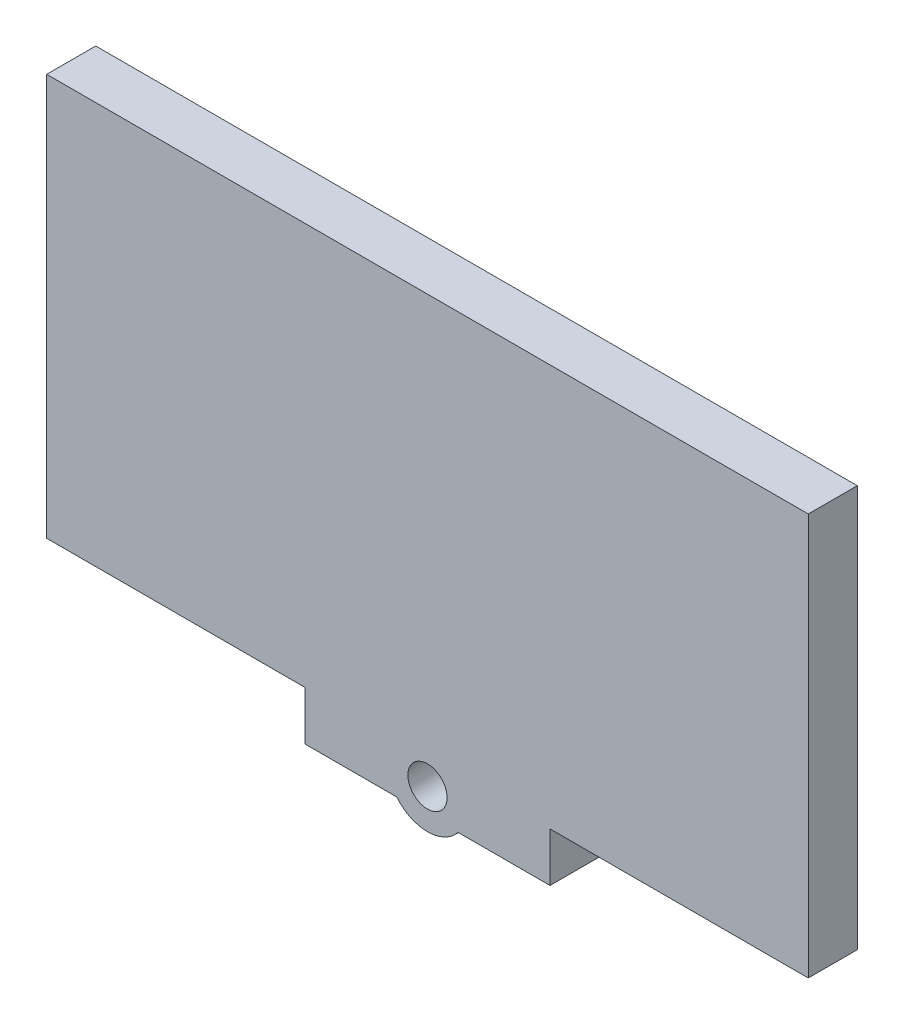
ISO-10303-21;
HEADER;
FILE_DESCRIPTION(('STEP AP214'),'2;1');
FILE_NAME('part.step','',(''),(''),'','','');
FILE_SCHEMA(('AUTOMOTIVE_DESIGN { 1 0 10303 214 1 1 1 1 }'));
ENDSEC;
DATA;
#1=APPLICATION_CONTEXT('core data for automotive mechanical design processes');
#2=APPLICATION_PROTOCOL_DEFINITION('international standard','automotive_design',2000,#1);
#3=PRODUCT_CONTEXT('',#1,'mechanical');
#4=PRODUCT('Part','Part','',(#3));
#5=PRODUCT_RELATED_PRODUCT_CATEGORY('part','',(#4));
#6=PRODUCT_DEFINITION_FORMATION('','',#4);
#7=PRODUCT_DEFINITION_CONTEXT('part definition',#1,'design');
#8=PRODUCT_DEFINITION('design','',#6,#7);
#9=PRODUCT_DEFINITION_SHAPE('','',#8);
#10=(LENGTH_UNIT() NAMED_UNIT(*) SI_UNIT(.MILLI.,.METRE.));
#11=(NAMED_UNIT(*) PLANE_ANGLE_UNIT() SI_UNIT($,.RADIAN.));
#12=(NAMED_UNIT(*) SI_UNIT($,.STERADIAN.) SOLID_ANGLE_UNIT());
#13=UNCERTAINTY_MEASURE_WITH_UNIT(LENGTH_MEASURE(1.E-05),#10,'distance_accuracy_value','');
#14=(GEOMETRIC_REPRESENTATION_CONTEXT(3) GLOBAL_UNCERTAINTY_ASSIGNED_CONTEXT((#13)) GLOBAL_UNIT_ASSIGNED_CONTEXT((#10,
#11,#12)) REPRESENTATION_CONTEXT('',''));
#15=CARTESIAN_POINT('',(0.,0.,0.));
#16=DIRECTION('',(0.,0.,1.));
#17=DIRECTION('',(1.,0.,0.));
#18=AXIS2_PLACEMENT_3D('',#15,#16,#17);
#19=CARTESIAN_POINT('',(-12.5,-25.5,0.));
#20=DIRECTION('',(0.,-1.,0.));
#21=DIRECTION('',(0.,0.,-1.));
#22=AXIS2_PLACEMENT_3D('',#19,#20,#21);
#23=PLANE('',#22);
#24=DIRECTION('',(0.,0.,1.));
#25=VECTOR('',#24,1.);
#26=CARTESIAN_POINT('',(3.12100929492651,-25.5,0.));
#27=LINE('',#26,#25);
#28=CARTESIAN_POINT('',(3.12100929492651,-25.5,0.));
#29=VERTEX_POINT('',#28);
#30=CARTESIAN_POINT('',(3.12100929492651,-25.5,5.));
#31=VERTEX_POINT('',#30);
#32=EDGE_CURVE('E11',#29,#31,#27,.T.);
#33=ORIENTED_EDGE('',*,*,#32,.F.);
#34=DIRECTION('',(1.,0.,0.));
#35=VECTOR('',#34,1.);
#36=CARTESIAN_POINT('',(-12.5,-25.5,0.));
#37=LINE('',#36,#35);
#38=CARTESIAN_POINT('',(12.5,-25.5,0.));
#39=VERTEX_POINT('',#38);
#40=EDGE_CURVE('E190',#29,#39,#37,.T.);
#41=ORIENTED_EDGE('',*,*,#40,.T.);
#42=DIRECTION('',(0.,0.,1.));
#43=VECTOR('',#42,1.);
#44=CARTESIAN_POINT('',(12.5,-25.5,0.));
#45=LINE('',#44,#43);
#46=CARTESIAN_POINT('',(12.5,-25.5,5.));
#47=VERTEX_POINT('',#46);
#48=EDGE_CURVE('E139',#39,#47,#45,.T.);
#49=ORIENTED_EDGE('',*,*,#48,.T.);
#50=DIRECTION('',(1.,0.,0.));
#51=VECTOR('',#50,1.);
#52=CARTESIAN_POINT('',(-12.5,-25.5,5.));
#53=LINE('',#52,#51);
#54=EDGE_CURVE('E126',#31,#47,#53,.T.);
#55=ORIENTED_EDGE('',*,*,#54,.F.);
#56=EDGE_LOOP('',(#33,#41,#49,#55));
#57=FACE_BOUND('',#56,.T.);
#58=ADVANCED_FACE('F33',(#57),#23,.T.);
#59=CARTESIAN_POINT('',(-38.85,-20.5,5.));
#60=DIRECTION('',(0.,1.,0.));
#61=DIRECTION('',(0.,0.,1.));
#62=AXIS2_PLACEMENT_3D('',#59,#60,#61);
#63=PLANE('',#62);
#64=DIRECTION('',(0.,0.,1.));
#65=VECTOR('',#64,1.);
#66=CARTESIAN_POINT('',(12.5,-20.5,0.));
#67=LINE('',#66,#65);
#68=CARTESIAN_POINT('',(12.5,-20.5,0.));
#69=VERTEX_POINT('',#68);
#70=CARTESIAN_POINT('',(12.5,-20.5,5.));
#71=VERTEX_POINT('',#70);
#72=EDGE_CURVE('E137',#69,#71,#67,.T.);
#73=ORIENTED_EDGE('',*,*,#72,.F.);
#74=DIRECTION('',(1.,0.,0.));
#75=VECTOR('',#74,1.);
#76=CARTESIAN_POINT('',(-38.85,-20.5,0.));
#77=LINE('',#76,#75);
#78=CARTESIAN_POINT('',(38.85,-20.5,0.));
#79=VERTEX_POINT('',#78);
#80=EDGE_CURVE('E159',#69,#79,#77,.T.);
#81=ORIENTED_EDGE('',*,*,#80,.T.);
#82=DIRECTION('',(0.,0.,-1.));
#83=VECTOR('',#82,1.);
#84=CARTESIAN_POINT('',(38.85,-20.5,5.));
#85=LINE('',#84,#83);
#86=CARTESIAN_POINT('',(38.85,-20.5,5.));
#87=VERTEX_POINT('',#86);
#88=EDGE_CURVE('E171',#87,#79,#85,.T.);
#89=ORIENTED_EDGE('',*,*,#88,.F.);
#90=DIRECTION('',(1.,0.,0.));
#91=VECTOR('',#90,1.);
#92=CARTESIAN_POINT('',(-38.85,-20.5,5.));
#93=LINE('',#92,#91);
#94=EDGE_CURVE('E148',#71,#87,#93,.T.);
#95=ORIENTED_EDGE('',*,*,#94,.F.);
#96=EDGE_LOOP('',(#73,#81,#89,#95));
#97=FACE_BOUND('',#96,.T.);
#98=ADVANCED_FACE('F205',(#97),#63,.F.);
#99=CARTESIAN_POINT('',(-38.85,20.5,5.));
#100=DIRECTION('',(1.,0.,0.));
#101=DIRECTION('',(0.,0.,-1.));
#102=AXIS2_PLACEMENT_3D('',#99,#100,#101);
#103=PLANE('',#102);
#104=DIRECTION('',(0.,-1.,0.));
#105=VECTOR('',#104,1.);
#106=CARTESIAN_POINT('',(-38.85,20.5,0.));
#107=LINE('',#106,#105);
#108=CARTESIAN_POINT('',(-38.85,20.5,0.));
#109=VERTEX_POINT('',#108);
#110=CARTESIAN_POINT('',(-38.85,-20.5,0.));
#111=VERTEX_POINT('',#110);
#112=EDGE_CURVE('E136',#109,#111,#107,.T.);
#113=ORIENTED_EDGE('',*,*,#112,.T.);
#114=DIRECTION('',(0.,0.,-1.));
#115=VECTOR('',#114,1.);
#116=CARTESIAN_POINT('',(-38.85,-20.5,5.));
#117=LINE('',#116,#115);
#118=CARTESIAN_POINT('',(-38.85,-20.5,5.));
#119=VERTEX_POINT('',#118);
#120=EDGE_CURVE('E121',#119,#111,#117,.T.);
#121=ORIENTED_EDGE('',*,*,#120,.F.);
#122=DIRECTION('',(0.,-1.,0.));
#123=VECTOR('',#122,1.);
#124=CARTESIAN_POINT('',(-38.85,20.5,5.));
#125=LINE('',#124,#123);
#126=CARTESIAN_POINT('',(-38.85,20.5,5.));
#127=VERTEX_POINT('',#126);
#128=EDGE_CURVE('E145',#127,#119,#125,.T.);
#129=ORIENTED_EDGE('',*,*,#128,.F.);
#130=DIRECTION('',(0.,0.,-1.));
#131=VECTOR('',#130,1.);
#132=CARTESIAN_POINT('',(-38.85,20.5,5.));
#133=LINE('',#132,#131);
#134=EDGE_CURVE('E156',#127,#109,#133,.T.);
#135=ORIENTED_EDGE('',*,*,#134,.T.);
#136=EDGE_LOOP('',(#113,#121,#129,#135));
#137=FACE_BOUND('',#136,.T.);
#138=ADVANCED_FACE('F35',(#137),#103,.F.);
#139=CARTESIAN_POINT('',(-12.5,-20.5,0.));
#140=VERTEX_POINT('',#139);
#141=EDGE_CURVE('E160',#111,#140,#77,.T.);
#142=ORIENTED_EDGE('',*,*,#141,.T.);
#143=DIRECTION('',(0.,0.,1.));
#144=VECTOR('',#143,1.);
#145=CARTESIAN_POINT('',(-12.5,-20.5,0.));
#146=LINE('',#145,#144);
#147=CARTESIAN_POINT('',(-12.5,-20.5,5.));
#148=VERTEX_POINT('',#147);
#149=EDGE_CURVE('E134',#140,#148,#146,.T.);
#150=ORIENTED_EDGE('',*,*,#149,.T.);
#151=EDGE_CURVE('E150',#119,#148,#93,.T.);
#152=ORIENTED_EDGE('',*,*,#151,.F.);
#153=ORIENTED_EDGE('',*,*,#120,.T.);
#154=EDGE_LOOP('',(#142,#150,#152,#153));
#155=FACE_BOUND('',#154,.T.);
#156=ADVANCED_FACE('F177',(#155),#63,.F.);
#157=CARTESIAN_POINT('',(38.85,20.5,5.));
#158=DIRECTION('',(-1.,0.,0.));
#159=DIRECTION('',(0.,-1.,0.));
#160=AXIS2_PLACEMENT_3D('',#157,#158,#159);
#161=PLANE('',#160);
#162=DIRECTION('',(0.,1.,0.));
#163=VECTOR('',#162,1.);
#164=CARTESIAN_POINT('',(38.85,20.5,0.));
#165=LINE('',#164,#163);
#166=CARTESIAN_POINT('',(38.85,20.5,0.));
#167=VERTEX_POINT('',#166);
#168=EDGE_CURVE('E163',#79,#167,#165,.T.);
#169=ORIENTED_EDGE('',*,*,#168,.T.);
#170=DIRECTION('',(0.,0.,-1.));
#171=VECTOR('',#170,1.);
#172=CARTESIAN_POINT('',(38.85,20.5,5.));
#173=LINE('',#172,#171);
#174=CARTESIAN_POINT('',(38.85,20.5,5.));
#175=VERTEX_POINT('',#174);
#176=EDGE_CURVE('E168',#175,#167,#173,.T.);
#177=ORIENTED_EDGE('',*,*,#176,.F.);
#178=DIRECTION('',(0.,1.,0.));
#179=VECTOR('',#178,1.);
#180=CARTESIAN_POINT('',(38.85,20.5,5.));
#181=LINE('',#180,#179);
#182=EDGE_CURVE('E152',#87,#175,#181,.T.);
#183=ORIENTED_EDGE('',*,*,#182,.F.);
#184=ORIENTED_EDGE('',*,*,#88,.T.);
#185=EDGE_LOOP('',(#169,#177,#183,#184));
#186=FACE_BOUND('',#185,.T.);
#187=ADVANCED_FACE('F209',(#186),#161,.F.);
#188=CARTESIAN_POINT('',(-38.85,20.5,5.));
#189=DIRECTION('',(0.,-1.,0.));
#190=DIRECTION('',(0.,0.,-1.));
#191=AXIS2_PLACEMENT_3D('',#188,#189,#190);
#192=PLANE('',#191);
#193=DIRECTION('',(-1.,0.,0.));
#194=VECTOR('',#193,1.);
#195=CARTESIAN_POINT('',(-38.85,20.5,0.));
#196=LINE('',#195,#194);
#197=EDGE_CURVE('E149',#167,#109,#196,.T.);
#198=ORIENTED_EDGE('',*,*,#197,.T.);
#199=ORIENTED_EDGE('',*,*,#134,.F.);
#200=DIRECTION('',(-1.,0.,0.));
#201=VECTOR('',#200,1.);
#202=CARTESIAN_POINT('',(-38.85,20.5,5.));
#203=LINE('',#202,#201);
#204=EDGE_CURVE('E154',#175,#127,#203,.T.);
#205=ORIENTED_EDGE('',*,*,#204,.F.);
#206=ORIENTED_EDGE('',*,*,#176,.T.);
#207=EDGE_LOOP('',(#198,#199,#205,#206));
#208=FACE_BOUND('',#207,.T.);
#209=ADVANCED_FACE('F213',(#208),#192,.F.);
#210=CARTESIAN_POINT('',(0.,0.,5.));
#211=DIRECTION('',(0.,0.,1.));
#212=DIRECTION('',(1.,0.,0.));
#213=AXIS2_PLACEMENT_3D('',#210,#211,#212);
#214=PLANE('',#213);
#215=CARTESIAN_POINT('',(-12.5,-25.5,5.));
#216=VERTEX_POINT('',#215);
#217=CARTESIAN_POINT('',(-3.12398870347189,-25.5,5.));
#218=VERTEX_POINT('',#217);
#219=EDGE_CURVE('E118',#216,#218,#53,.T.);
#220=ORIENTED_EDGE('',*,*,#219,.T.);
#221=CARTESIAN_POINT('',(-0.00148970427268913,-23.,5.));
#222=DIRECTION('',(0.,0.,1.));
#223=DIRECTION('',(1.,0.,0.));
#224=AXIS2_PLACEMENT_3D('',#221,#222,#223);
#225=CIRCLE('',#224,4.);
#226=EDGE_CURVE('E48',#218,#31,#225,.T.);
#227=ORIENTED_EDGE('',*,*,#226,.T.);
#228=ORIENTED_EDGE('',*,*,#54,.T.);
#229=DIRECTION('',(0.,1.,0.));
#230=VECTOR('',#229,1.);
#231=CARTESIAN_POINT('',(12.5,-20.5,5.));
#232=LINE('',#231,#230);
#233=EDGE_CURVE('E125',#47,#71,#232,.T.);
#234=ORIENTED_EDGE('',*,*,#233,.T.);
#235=ORIENTED_EDGE('',*,*,#94,.T.);
#236=ORIENTED_EDGE('',*,*,#182,.T.);
#237=ORIENTED_EDGE('',*,*,#204,.T.);
#238=ORIENTED_EDGE('',*,*,#128,.T.);
#239=ORIENTED_EDGE('',*,*,#151,.T.);
#240=DIRECTION('',(0.,-1.,0.));
#241=VECTOR('',#240,1.);
#242=CARTESIAN_POINT('',(-12.5,-20.5,5.));
#243=LINE('',#242,#241);
#244=EDGE_CURVE('E55',#148,#216,#243,.T.);
#245=ORIENTED_EDGE('',*,*,#244,.T.);
#246=EDGE_LOOP('',(#220,#227,#228,#234,#235,#236,#237,#238,#239,#245));
#247=FACE_BOUND('',#246,.T.);
#248=CARTESIAN_POINT('',(-0.00148970427268913,-23.,5.));
#249=DIRECTION('',(0.,0.,1.));
#250=DIRECTION('',(1.,0.,0.));
#251=AXIS2_PLACEMENT_3D('',#248,#249,#250);
#252=CIRCLE('',#251,2.);
#253=CARTESIAN_POINT('',(1.99851029572731,-23.,5.));
#254=VERTEX_POINT('',#253);
#255=EDGE_CURVE('E194',#254,#254,#252,.T.);
#256=ORIENTED_EDGE('',*,*,#255,.F.);
#257=EDGE_LOOP('',(#256));
#258=FACE_BOUND('',#257,.T.);
#259=ADVANCED_FACE('F122',(#247,#258),#214,.T.);
#260=CARTESIAN_POINT('',(0.,0.,0.));
#261=DIRECTION('',(0.,0.,1.));
#262=DIRECTION('',(1.,0.,0.));
#263=AXIS2_PLACEMENT_3D('',#260,#261,#262);
#264=PLANE('',#263);
#265=ORIENTED_EDGE('',*,*,#40,.F.);
#266=CARTESIAN_POINT('',(-0.00148970427268913,-23.,0.));
#267=DIRECTION('',(0.,0.,1.));
#268=DIRECTION('',(1.,0.,0.));
#269=AXIS2_PLACEMENT_3D('',#266,#267,#268);
#270=CIRCLE('',#269,4.);
#271=CARTESIAN_POINT('',(-3.12398870347189,-25.5,0.));
#272=VERTEX_POINT('',#271);
#273=EDGE_CURVE('E112',#272,#29,#270,.T.);
#274=ORIENTED_EDGE('',*,*,#273,.F.);
#275=CARTESIAN_POINT('',(-12.5,-25.5,0.));
#276=VERTEX_POINT('',#275);
#277=EDGE_CURVE('E120',#276,#272,#37,.T.);
#278=ORIENTED_EDGE('',*,*,#277,.F.);
#279=DIRECTION('',(0.,-1.,0.));
#280=VECTOR('',#279,1.);
#281=CARTESIAN_POINT('',(-12.5,-20.5,0.));
#282=LINE('',#281,#280);
#283=EDGE_CURVE('E129',#140,#276,#282,.T.);
#284=ORIENTED_EDGE('',*,*,#283,.F.);
#285=ORIENTED_EDGE('',*,*,#141,.F.);
#286=ORIENTED_EDGE('',*,*,#112,.F.);
#287=ORIENTED_EDGE('',*,*,#197,.F.);
#288=ORIENTED_EDGE('',*,*,#168,.F.);
#289=ORIENTED_EDGE('',*,*,#80,.F.);
#290=DIRECTION('',(0.,1.,0.));
#291=VECTOR('',#290,1.);
#292=CARTESIAN_POINT('',(12.5,-20.5,0.));
#293=LINE('',#292,#291);
#294=EDGE_CURVE('E144',#39,#69,#293,.T.);
#295=ORIENTED_EDGE('',*,*,#294,.F.);
#296=EDGE_LOOP('',(#265,#274,#278,#284,#285,#286,#287,#288,#289,#295));
#297=FACE_BOUND('',#296,.T.);
#298=CARTESIAN_POINT('',(-0.00148970427268913,-23.,0.));
#299=DIRECTION('',(0.,0.,1.));
#300=DIRECTION('',(1.,0.,0.));
#301=AXIS2_PLACEMENT_3D('',#298,#299,#300);
#302=CIRCLE('',#301,2.);
#303=CARTESIAN_POINT('',(1.99851029572731,-23.,0.));
#304=VERTEX_POINT('',#303);
#305=EDGE_CURVE('E217',#304,#304,#302,.T.);
#306=ORIENTED_EDGE('',*,*,#305,.T.);
#307=EDGE_LOOP('',(#306));
#308=FACE_BOUND('',#307,.T.);
#309=ADVANCED_FACE('F185',(#297,#308),#264,.F.);
#310=CARTESIAN_POINT('',(-12.5,-20.5,0.));
#311=DIRECTION('',(-1.,0.,0.));
#312=DIRECTION('',(0.,0.,1.));
#313=AXIS2_PLACEMENT_3D('',#310,#311,#312);
#314=PLANE('',#313);
#315=ORIENTED_EDGE('',*,*,#244,.F.);
#316=ORIENTED_EDGE('',*,*,#149,.F.);
#317=ORIENTED_EDGE('',*,*,#283,.T.);
#318=DIRECTION('',(0.,0.,1.));
#319=VECTOR('',#318,1.);
#320=CARTESIAN_POINT('',(-12.5,-25.5,0.));
#321=LINE('',#320,#319);
#322=EDGE_CURVE('E142',#276,#216,#321,.T.);
#323=ORIENTED_EDGE('',*,*,#322,.T.);
#324=EDGE_LOOP('',(#315,#316,#317,#323));
#325=FACE_BOUND('',#324,.T.);
#326=ADVANCED_FACE('F232',(#325),#314,.T.);
#327=CARTESIAN_POINT('',(12.5,-20.5,0.));
#328=DIRECTION('',(1.,0.,0.));
#329=DIRECTION('',(0.,0.,-1.));
#330=AXIS2_PLACEMENT_3D('',#327,#328,#329);
#331=PLANE('',#330);
#332=ORIENTED_EDGE('',*,*,#233,.F.);
#333=ORIENTED_EDGE('',*,*,#48,.F.);
#334=ORIENTED_EDGE('',*,*,#294,.T.);
#335=ORIENTED_EDGE('',*,*,#72,.T.);
#336=EDGE_LOOP('',(#332,#333,#334,#335));
#337=FACE_BOUND('',#336,.T.);
#338=ADVANCED_FACE('F201',(#337),#331,.T.);
#339=DIRECTION('',(0.,0.,1.));
#340=VECTOR('',#339,1.);
#341=CARTESIAN_POINT('',(-3.12398870347189,-25.5,0.));
#342=LINE('',#341,#340);
#343=EDGE_CURVE('E41',#218,#272,#342,.F.);
#344=ORIENTED_EDGE('',*,*,#343,.F.);
#345=ORIENTED_EDGE('',*,*,#219,.F.);
#346=ORIENTED_EDGE('',*,*,#322,.F.);
#347=ORIENTED_EDGE('',*,*,#277,.T.);
#348=EDGE_LOOP('',(#344,#345,#346,#347));
#349=FACE_BOUND('',#348,.T.);
#350=ADVANCED_FACE('F117',(#349),#23,.T.);
#351=CARTESIAN_POINT('',(-0.00148970427268913,-23.,0.));
#352=DIRECTION('',(0.,0.,1.));
#353=DIRECTION('',(1.,0.,0.));
#354=AXIS2_PLACEMENT_3D('',#351,#352,#353);
#355=CYLINDRICAL_SURFACE('',#354,2.);
#356=ORIENTED_EDGE('',*,*,#305,.F.);
#357=EDGE_LOOP('',(#356));
#358=FACE_BOUND('',#357,.T.);
#359=ORIENTED_EDGE('',*,*,#255,.T.);
#360=EDGE_LOOP('',(#359));
#361=FACE_BOUND('',#360,.T.);
#362=ADVANCED_FACE('F221',(#358,#361),#355,.F.);
#363=CARTESIAN_POINT('',(-0.00148970427268913,-23.,0.));
#364=DIRECTION('',(0.,0.,1.));
#365=DIRECTION('',(1.,0.,0.));
#366=AXIS2_PLACEMENT_3D('',#363,#364,#365);
#367=CYLINDRICAL_SURFACE('',#366,4.);
#368=ORIENTED_EDGE('',*,*,#273,.T.);
#369=ORIENTED_EDGE('',*,*,#32,.T.);
#370=ORIENTED_EDGE('',*,*,#226,.F.);
#371=ORIENTED_EDGE('',*,*,#343,.T.);
#372=EDGE_LOOP('',(#368,#369,#370,#371));
#373=FACE_BOUND('',#372,.T.);
#374=ADVANCED_FACE('F108',(#373),#367,.T.);
#375=CLOSED_SHELL('',(#58,#98,#138,#156,#187,#209,#259,#309,#326,#338,#350,#362,#374));
#376=MANIFOLD_SOLID_BREP('B2',#375);
#377=ADVANCED_BREP_SHAPE_REPRESENTATION('',(#18,#376),#14);
#378=SHAPE_DEFINITION_REPRESENTATION(#9,#377);
ENDSEC;
END-ISO-10303-21;
